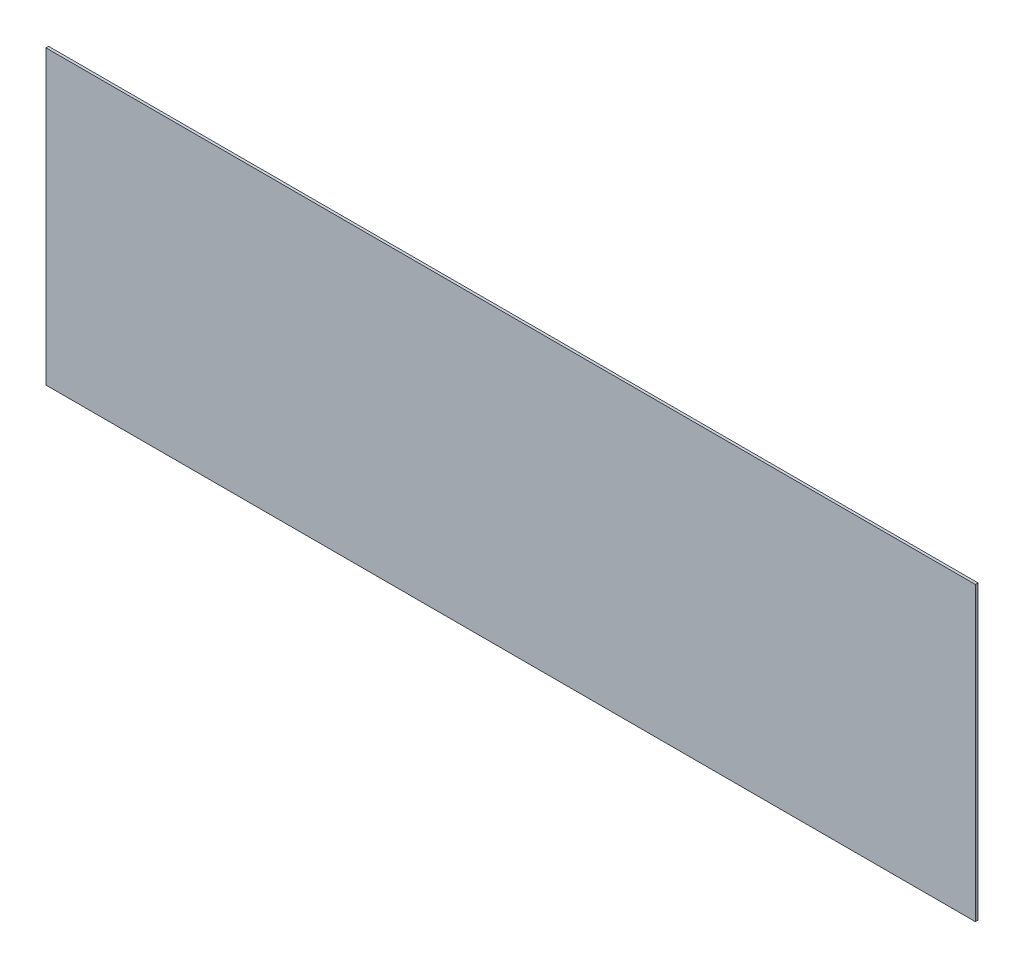
ISO-10303-21;
HEADER;
FILE_DESCRIPTION(('STEP AP214'),'2;1');
FILE_NAME('part.step','',(''),(''),'','','');
FILE_SCHEMA(('AUTOMOTIVE_DESIGN { 1 0 10303 214 1 1 1 1 }'));
ENDSEC;
DATA;
#1=APPLICATION_CONTEXT('core data for automotive mechanical design processes');
#2=APPLICATION_PROTOCOL_DEFINITION('international standard','automotive_design',2000,#1);
#3=PRODUCT_CONTEXT('',#1,'mechanical');
#4=PRODUCT('Part','Part','',(#3));
#5=PRODUCT_RELATED_PRODUCT_CATEGORY('part','',(#4));
#6=PRODUCT_DEFINITION_FORMATION('','',#4);
#7=PRODUCT_DEFINITION_CONTEXT('part definition',#1,'design');
#8=PRODUCT_DEFINITION('design','',#6,#7);
#9=PRODUCT_DEFINITION_SHAPE('','',#8);
#10=(LENGTH_UNIT() NAMED_UNIT(*) SI_UNIT(.MILLI.,.METRE.));
#11=(NAMED_UNIT(*) PLANE_ANGLE_UNIT() SI_UNIT($,.RADIAN.));
#12=(NAMED_UNIT(*) SI_UNIT($,.STERADIAN.) SOLID_ANGLE_UNIT());
#13=UNCERTAINTY_MEASURE_WITH_UNIT(LENGTH_MEASURE(1.E-05),#10,'distance_accuracy_value','');
#14=(GEOMETRIC_REPRESENTATION_CONTEXT(3) GLOBAL_UNCERTAINTY_ASSIGNED_CONTEXT((#13)) GLOBAL_UNIT_ASSIGNED_CONTEXT((#10,
#11,#12)) REPRESENTATION_CONTEXT('',''));
#15=CARTESIAN_POINT('',(0.,0.,0.));
#16=DIRECTION('',(0.,0.,1.));
#17=DIRECTION('',(1.,0.,0.));
#18=AXIS2_PLACEMENT_3D('',#15,#16,#17);
#19=CARTESIAN_POINT('',(-34.9827303545167,16.9762202043133,0.200000000000002));
#20=DIRECTION('',(1.,0.,0.));
#21=DIRECTION('',(0.,0.,-1.));
#22=AXIS2_PLACEMENT_3D('',#19,#20,#21);
#23=PLANE('',#22);
#24=DIRECTION('',(0.,-1.,0.));
#25=VECTOR('',#24,1.);
#26=CARTESIAN_POINT('',(-34.9827303545167,16.9762202043133,0.));
#27=LINE('',#26,#25);
#28=CARTESIAN_POINT('',(-34.9827303545167,16.9762202043133,0.));
#29=VERTEX_POINT('',#28);
#30=CARTESIAN_POINT('',(-34.9827303545167,-5.02377979568672,0.));
#31=VERTEX_POINT('',#30);
#32=EDGE_CURVE('E95',#29,#31,#27,.T.);
#33=ORIENTED_EDGE('',*,*,#32,.T.);
#34=DIRECTION('',(0.,0.,-1.));
#35=VECTOR('',#34,1.);
#36=CARTESIAN_POINT('',(-34.9827303545167,-5.02377979568672,0.200000000000002));
#37=LINE('',#36,#35);
#38=CARTESIAN_POINT('',(-34.9827303545167,-5.02377979568672,0.200000000000002));
#39=VERTEX_POINT('',#38);
#40=EDGE_CURVE('E11',#39,#31,#37,.T.);
#41=ORIENTED_EDGE('',*,*,#40,.F.);
#42=DIRECTION('',(0.,-1.,0.));
#43=VECTOR('',#42,1.);
#44=CARTESIAN_POINT('',(-34.9827303545167,16.9762202043133,0.200000000000002));
#45=LINE('',#44,#43);
#46=CARTESIAN_POINT('',(-34.9827303545167,16.9762202043133,0.200000000000002));
#47=VERTEX_POINT('',#46);
#48=EDGE_CURVE('E83',#47,#39,#45,.T.);
#49=ORIENTED_EDGE('',*,*,#48,.F.);
#50=DIRECTION('',(0.,0.,-1.));
#51=VECTOR('',#50,1.);
#52=CARTESIAN_POINT('',(-34.9827303545167,16.9762202043133,0.200000000000002));
#53=LINE('',#52,#51);
#54=EDGE_CURVE('E91',#47,#29,#53,.T.);
#55=ORIENTED_EDGE('',*,*,#54,.T.);
#56=EDGE_LOOP('',(#33,#41,#49,#55));
#57=FACE_BOUND('',#56,.T.);
#58=ADVANCED_FACE('F32',(#57),#23,.F.);
#59=CARTESIAN_POINT('',(-34.9827303545167,-5.02377979568672,0.200000000000002));
#60=DIRECTION('',(0.,1.,0.));
#61=DIRECTION('',(0.,0.,1.));
#62=AXIS2_PLACEMENT_3D('',#59,#60,#61);
#63=PLANE('',#62);
#64=DIRECTION('',(1.,0.,0.));
#65=VECTOR('',#64,1.);
#66=CARTESIAN_POINT('',(-34.9827303545167,-5.02377979568672,0.));
#67=LINE('',#66,#65);
#68=CARTESIAN_POINT('',(35.0172696454833,-5.02377979568672,0.));
#69=VERTEX_POINT('',#68);
#70=EDGE_CURVE('E87',#31,#69,#67,.T.);
#71=ORIENTED_EDGE('',*,*,#70,.T.);
#72=DIRECTION('',(0.,0.,-1.));
#73=VECTOR('',#72,1.);
#74=CARTESIAN_POINT('',(35.0172696454833,-5.02377979568672,0.200000000000013));
#75=LINE('',#74,#73);
#76=CARTESIAN_POINT('',(35.0172696454833,-5.02377979568672,0.200000000000013));
#77=VERTEX_POINT('',#76);
#78=EDGE_CURVE('E40',#77,#69,#75,.T.);
#79=ORIENTED_EDGE('',*,*,#78,.F.);
#80=DIRECTION('',(1.,0.,0.));
#81=VECTOR('',#80,1.);
#82=CARTESIAN_POINT('',(-34.9827303545167,-5.02377979568672,0.200000000000002));
#83=LINE('',#82,#81);
#84=EDGE_CURVE('E78',#39,#77,#83,.T.);
#85=ORIENTED_EDGE('',*,*,#84,.F.);
#86=ORIENTED_EDGE('',*,*,#40,.T.);
#87=EDGE_LOOP('',(#71,#79,#85,#86));
#88=FACE_BOUND('',#87,.T.);
#89=ADVANCED_FACE('F86',(#88),#63,.F.);
#90=CARTESIAN_POINT('',(35.0172696454833,16.9762202043133,0.200000000000013));
#91=DIRECTION('',(-1.,0.,0.));
#92=DIRECTION('',(0.,0.,1.));
#93=AXIS2_PLACEMENT_3D('',#90,#91,#92);
#94=PLANE('',#93);
#95=DIRECTION('',(0.,1.,0.));
#96=VECTOR('',#95,1.);
#97=CARTESIAN_POINT('',(35.0172696454833,16.9762202043133,0.));
#98=LINE('',#97,#96);
#99=CARTESIAN_POINT('',(35.0172696454833,16.9762202043133,0.));
#100=VERTEX_POINT('',#99);
#101=EDGE_CURVE('E65',#69,#100,#98,.T.);
#102=ORIENTED_EDGE('',*,*,#101,.T.);
#103=DIRECTION('',(0.,0.,-1.));
#104=VECTOR('',#103,1.);
#105=CARTESIAN_POINT('',(35.0172696454833,16.9762202043133,0.200000000000013));
#106=LINE('',#105,#104);
#107=CARTESIAN_POINT('',(35.0172696454833,16.9762202043133,0.200000000000013));
#108=VERTEX_POINT('',#107);
#109=EDGE_CURVE('E88',#108,#100,#106,.T.);
#110=ORIENTED_EDGE('',*,*,#109,.F.);
#111=DIRECTION('',(0.,1.,0.));
#112=VECTOR('',#111,1.);
#113=CARTESIAN_POINT('',(35.0172696454833,16.9762202043133,0.200000000000013));
#114=LINE('',#113,#112);
#115=EDGE_CURVE('E81',#77,#108,#114,.T.);
#116=ORIENTED_EDGE('',*,*,#115,.F.);
#117=ORIENTED_EDGE('',*,*,#78,.T.);
#118=EDGE_LOOP('',(#102,#110,#116,#117));
#119=FACE_BOUND('',#118,.T.);
#120=ADVANCED_FACE('F89',(#119),#94,.F.);
#121=CARTESIAN_POINT('',(-34.9827303545167,16.9762202043133,0.200000000000002));
#122=DIRECTION('',(0.,-1.,0.));
#123=DIRECTION('',(0.,0.,-1.));
#124=AXIS2_PLACEMENT_3D('',#121,#122,#123);
#125=PLANE('',#124);
#126=DIRECTION('',(-1.,0.,0.));
#127=VECTOR('',#126,1.);
#128=CARTESIAN_POINT('',(-34.9827303545167,16.9762202043133,0.));
#129=LINE('',#128,#127);
#130=EDGE_CURVE('E71',#100,#29,#129,.T.);
#131=ORIENTED_EDGE('',*,*,#130,.T.);
#132=ORIENTED_EDGE('',*,*,#54,.F.);
#133=DIRECTION('',(-1.,0.,0.));
#134=VECTOR('',#133,1.);
#135=CARTESIAN_POINT('',(-34.9827303545167,16.9762202043133,0.200000000000002));
#136=LINE('',#135,#134);
#137=EDGE_CURVE('E48',#108,#47,#136,.T.);
#138=ORIENTED_EDGE('',*,*,#137,.F.);
#139=ORIENTED_EDGE('',*,*,#109,.T.);
#140=EDGE_LOOP('',(#131,#132,#138,#139));
#141=FACE_BOUND('',#140,.T.);
#142=ADVANCED_FACE('F102',(#141),#125,.F.);
#143=CARTESIAN_POINT('',(-34.9827303545167,-5.02377979568672,0.200000000000002));
#144=DIRECTION('',(0.,0.,1.));
#145=DIRECTION('',(1.,0.,0.));
#146=AXIS2_PLACEMENT_3D('',#143,#144,#145);
#147=PLANE('',#146);
#148=ORIENTED_EDGE('',*,*,#48,.T.);
#149=ORIENTED_EDGE('',*,*,#84,.T.);
#150=ORIENTED_EDGE('',*,*,#115,.T.);
#151=ORIENTED_EDGE('',*,*,#137,.T.);
#152=EDGE_LOOP('',(#148,#149,#150,#151));
#153=FACE_BOUND('',#152,.T.);
#154=ADVANCED_FACE('F79',(#153),#147,.T.);
#155=CARTESIAN_POINT('',(-34.9827303545167,-5.02377979568672,0.));
#156=DIRECTION('',(0.,0.,1.));
#157=DIRECTION('',(1.,0.,0.));
#158=AXIS2_PLACEMENT_3D('',#155,#156,#157);
#159=PLANE('',#158);
#160=ORIENTED_EDGE('',*,*,#32,.F.);
#161=ORIENTED_EDGE('',*,*,#130,.F.);
#162=ORIENTED_EDGE('',*,*,#101,.F.);
#163=ORIENTED_EDGE('',*,*,#70,.F.);
#164=EDGE_LOOP('',(#160,#161,#162,#163));
#165=FACE_BOUND('',#164,.T.);
#166=ADVANCED_FACE('F105',(#165),#159,.F.);
#167=CLOSED_SHELL('',(#58,#89,#120,#142,#154,#166));
#168=MANIFOLD_SOLID_BREP('B2',#167);
#169=ADVANCED_BREP_SHAPE_REPRESENTATION('',(#18,#168),#14);
#170=SHAPE_DEFINITION_REPRESENTATION(#9,#169);
ENDSEC;
END-ISO-10303-21;
